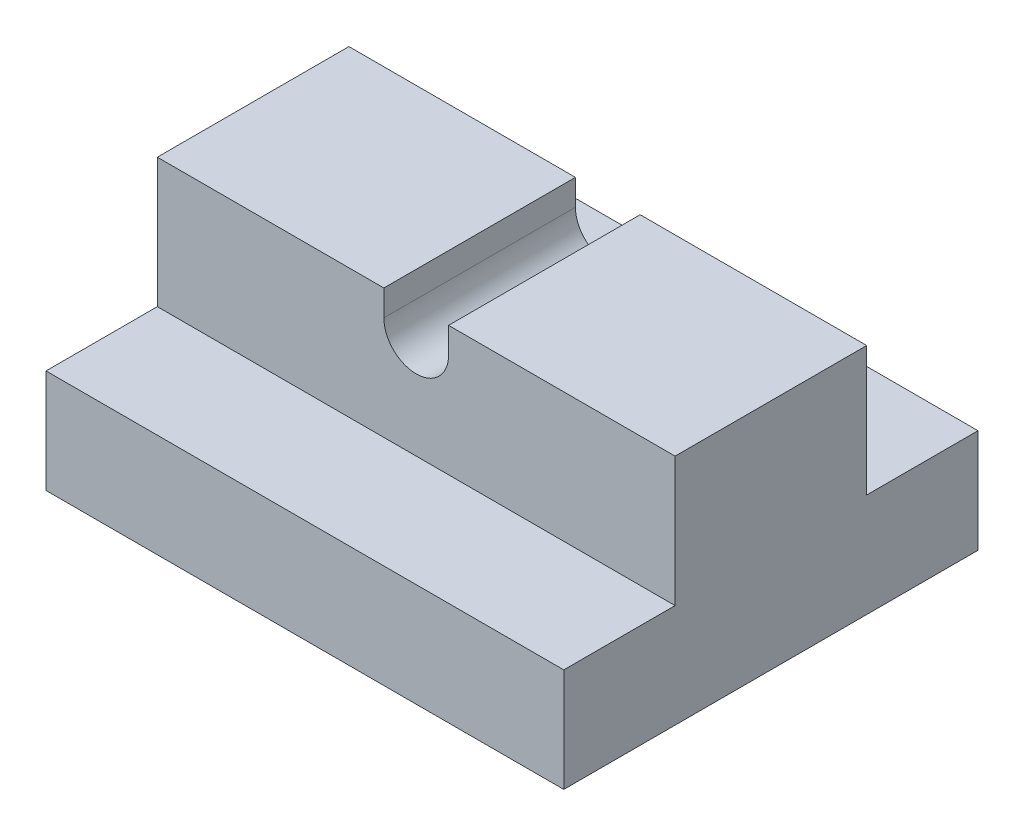
ISO-10303-21;
HEADER;
FILE_DESCRIPTION(('STEP AP214'),'2;1');
FILE_NAME('part.step','',(''),(''),'','','');
FILE_SCHEMA(('AUTOMOTIVE_DESIGN { 1 0 10303 214 1 1 1 1 }'));
ENDSEC;
DATA;
#1=APPLICATION_CONTEXT('core data for automotive mechanical design processes');
#2=APPLICATION_PROTOCOL_DEFINITION('international standard','automotive_design',2000,#1);
#3=PRODUCT_CONTEXT('',#1,'mechanical');
#4=PRODUCT('Part','Part','',(#3));
#5=PRODUCT_RELATED_PRODUCT_CATEGORY('part','',(#4));
#6=PRODUCT_DEFINITION_FORMATION('','',#4);
#7=PRODUCT_DEFINITION_CONTEXT('part definition',#1,'design');
#8=PRODUCT_DEFINITION('design','',#6,#7);
#9=PRODUCT_DEFINITION_SHAPE('','',#8);
#10=(LENGTH_UNIT() NAMED_UNIT(*) SI_UNIT(.MILLI.,.METRE.));
#11=(NAMED_UNIT(*) PLANE_ANGLE_UNIT() SI_UNIT($,.RADIAN.));
#12=(NAMED_UNIT(*) SI_UNIT($,.STERADIAN.) SOLID_ANGLE_UNIT());
#13=UNCERTAINTY_MEASURE_WITH_UNIT(LENGTH_MEASURE(1.E-05),#10,'distance_accuracy_value','');
#14=(GEOMETRIC_REPRESENTATION_CONTEXT(3) GLOBAL_UNCERTAINTY_ASSIGNED_CONTEXT((#13)) GLOBAL_UNIT_ASSIGNED_CONTEXT((#10,
#11,#12)) REPRESENTATION_CONTEXT('',''));
#15=CARTESIAN_POINT('',(0.,0.,0.));
#16=DIRECTION('',(0.,0.,1.));
#17=DIRECTION('',(1.,0.,0.));
#18=AXIS2_PLACEMENT_3D('',#15,#16,#17);
#19=CARTESIAN_POINT('',(0.,4.5,0.));
#20=DIRECTION('',(0.,-1.,0.));
#21=DIRECTION('',(0.,0.,-1.));
#22=AXIS2_PLACEMENT_3D('',#19,#20,#21);
#23=PLANE('',#22);
#24=DIRECTION('',(1.,0.,0.));
#25=VECTOR('',#24,1.);
#26=CARTESIAN_POINT('',(-5.,4.5,1.85));
#27=LINE('',#26,#25);
#28=CARTESIAN_POINT('',(-5.,4.5,1.85));
#29=VERTEX_POINT('',#28);
#30=CARTESIAN_POINT('',(-0.625000000000002,4.5,1.85));
#31=VERTEX_POINT('',#30);
#32=EDGE_CURVE('E163',#29,#31,#27,.T.);
#33=ORIENTED_EDGE('',*,*,#32,.T.);
#34=DIRECTION('',(0.,0.,1.));
#35=VECTOR('',#34,1.);
#36=CARTESIAN_POINT('',(-0.625000000000002,4.5,-4.001));
#37=LINE('',#36,#35);
#38=CARTESIAN_POINT('',(-0.625000000000002,4.5,-1.85));
#39=VERTEX_POINT('',#38);
#40=EDGE_CURVE('E151',#39,#31,#37,.T.);
#41=ORIENTED_EDGE('',*,*,#40,.F.);
#42=DIRECTION('',(-1.,0.,0.));
#43=VECTOR('',#42,1.);
#44=CARTESIAN_POINT('',(-5.,4.5,-1.85));
#45=LINE('',#44,#43);
#46=CARTESIAN_POINT('',(-5.,4.5,-1.85));
#47=VERTEX_POINT('',#46);
#48=EDGE_CURVE('E157',#39,#47,#45,.T.);
#49=ORIENTED_EDGE('',*,*,#48,.T.);
#50=DIRECTION('',(0.,0.,1.));
#51=VECTOR('',#50,1.);
#52=CARTESIAN_POINT('',(-5.,4.5,1.85));
#53=LINE('',#52,#51);
#54=EDGE_CURVE('E160',#47,#29,#53,.T.);
#55=ORIENTED_EDGE('',*,*,#54,.T.);
#56=EDGE_LOOP('',(#33,#41,#49,#55));
#57=FACE_BOUND('',#56,.T.);
#58=ADVANCED_FACE('F32',(#57),#23,.F.);
#59=CARTESIAN_POINT('',(0.,2.,0.));
#60=DIRECTION('',(0.,-1.,0.));
#61=DIRECTION('',(0.,0.,-1.));
#62=AXIS2_PLACEMENT_3D('',#59,#60,#61);
#63=PLANE('',#62);
#64=DIRECTION('',(1.,0.,0.));
#65=VECTOR('',#64,1.);
#66=CARTESIAN_POINT('',(-5.,2.,1.85));
#67=LINE('',#66,#65);
#68=CARTESIAN_POINT('',(-5.,2.,1.85));
#69=VERTEX_POINT('',#68);
#70=CARTESIAN_POINT('',(5.,2.,1.85));
#71=VERTEX_POINT('',#70);
#72=EDGE_CURVE('E55',#69,#71,#67,.T.);
#73=ORIENTED_EDGE('',*,*,#72,.F.);
#74=DIRECTION('',(0.,0.,1.));
#75=VECTOR('',#74,1.);
#76=CARTESIAN_POINT('',(-5.,2.,4.));
#77=LINE('',#76,#75);
#78=CARTESIAN_POINT('',(-5.,2.,4.));
#79=VERTEX_POINT('',#78);
#80=EDGE_CURVE('E187',#69,#79,#77,.T.);
#81=ORIENTED_EDGE('',*,*,#80,.T.);
#82=DIRECTION('',(1.,0.,0.));
#83=VECTOR('',#82,1.);
#84=CARTESIAN_POINT('',(-5.,2.,4.));
#85=LINE('',#84,#83);
#86=CARTESIAN_POINT('',(5.,2.,4.));
#87=VERTEX_POINT('',#86);
#88=EDGE_CURVE('E190',#79,#87,#85,.T.);
#89=ORIENTED_EDGE('',*,*,#88,.T.);
#90=DIRECTION('',(0.,0.,-1.));
#91=VECTOR('',#90,1.);
#92=CARTESIAN_POINT('',(5.,2.,4.));
#93=LINE('',#92,#91);
#94=EDGE_CURVE('E182',#87,#71,#93,.T.);
#95=ORIENTED_EDGE('',*,*,#94,.T.);
#96=EDGE_LOOP('',(#73,#81,#89,#95));
#97=FACE_BOUND('',#96,.T.);
#98=ADVANCED_FACE('F227',(#97),#63,.F.);
#99=DIRECTION('',(-1.,0.,0.));
#100=VECTOR('',#99,1.);
#101=CARTESIAN_POINT('',(-5.,2.,-1.85));
#102=LINE('',#101,#100);
#103=CARTESIAN_POINT('',(5.,2.,-1.85));
#104=VERTEX_POINT('',#103);
#105=CARTESIAN_POINT('',(-5.,2.,-1.85));
#106=VERTEX_POINT('',#105);
#107=EDGE_CURVE('E137',#104,#106,#102,.T.);
#108=ORIENTED_EDGE('',*,*,#107,.F.);
#109=CARTESIAN_POINT('',(5.,2.,-4.));
#110=VERTEX_POINT('',#109);
#111=EDGE_CURVE('E185',#104,#110,#93,.T.);
#112=ORIENTED_EDGE('',*,*,#111,.T.);
#113=DIRECTION('',(-1.,0.,0.));
#114=VECTOR('',#113,1.);
#115=CARTESIAN_POINT('',(-5.,2.,-4.));
#116=LINE('',#115,#114);
#117=CARTESIAN_POINT('',(-5.,2.,-4.));
#118=VERTEX_POINT('',#117);
#119=EDGE_CURVE('E184',#110,#118,#116,.T.);
#120=ORIENTED_EDGE('',*,*,#119,.T.);
#121=EDGE_CURVE('E188',#118,#106,#77,.T.);
#122=ORIENTED_EDGE('',*,*,#121,.T.);
#123=EDGE_LOOP('',(#108,#112,#120,#122));
#124=FACE_BOUND('',#123,.T.);
#125=ADVANCED_FACE('F241',(#124),#63,.F.);
#126=CARTESIAN_POINT('',(5.,2.,4.));
#127=DIRECTION('',(-1.,0.,0.));
#128=DIRECTION('',(0.,0.,1.));
#129=AXIS2_PLACEMENT_3D('',#126,#127,#128);
#130=PLANE('',#129);
#131=DIRECTION('',(0.,0.,-1.));
#132=VECTOR('',#131,1.);
#133=CARTESIAN_POINT('',(5.,0.,4.));
#134=LINE('',#133,#132);
#135=CARTESIAN_POINT('',(5.,0.,4.));
#136=VERTEX_POINT('',#135);
#137=CARTESIAN_POINT('',(5.,0.,-4.));
#138=VERTEX_POINT('',#137);
#139=EDGE_CURVE('E181',#136,#138,#134,.T.);
#140=ORIENTED_EDGE('',*,*,#139,.T.);
#141=DIRECTION('',(0.,-1.,0.));
#142=VECTOR('',#141,1.);
#143=CARTESIAN_POINT('',(5.,2.,-4.));
#144=LINE('',#143,#142);
#145=EDGE_CURVE('E11',#110,#138,#144,.T.);
#146=ORIENTED_EDGE('',*,*,#145,.F.);
#147=ORIENTED_EDGE('',*,*,#111,.F.);
#148=DIRECTION('',(0.,-1.,0.));
#149=VECTOR('',#148,1.);
#150=CARTESIAN_POINT('',(5.,4.5,-1.85));
#151=LINE('',#150,#149);
#152=CARTESIAN_POINT('',(5.,4.5,-1.85));
#153=VERTEX_POINT('',#152);
#154=EDGE_CURVE('E178',#153,#104,#151,.T.);
#155=ORIENTED_EDGE('',*,*,#154,.F.);
#156=DIRECTION('',(0.,0.,-1.));
#157=VECTOR('',#156,1.);
#158=CARTESIAN_POINT('',(5.,4.5,1.85));
#159=LINE('',#158,#157);
#160=CARTESIAN_POINT('',(5.,4.5,1.85));
#161=VERTEX_POINT('',#160);
#162=EDGE_CURVE('E154',#161,#153,#159,.T.);
#163=ORIENTED_EDGE('',*,*,#162,.F.);
#164=DIRECTION('',(0.,-1.,0.));
#165=VECTOR('',#164,1.);
#166=CARTESIAN_POINT('',(5.,4.5,1.85));
#167=LINE('',#166,#165);
#168=EDGE_CURVE('E166',#161,#71,#167,.T.);
#169=ORIENTED_EDGE('',*,*,#168,.T.);
#170=ORIENTED_EDGE('',*,*,#94,.F.);
#171=DIRECTION('',(0.,-1.,0.));
#172=VECTOR('',#171,1.);
#173=CARTESIAN_POINT('',(5.,2.,4.));
#174=LINE('',#173,#172);
#175=EDGE_CURVE('E192',#87,#136,#174,.T.);
#176=ORIENTED_EDGE('',*,*,#175,.T.);
#177=EDGE_LOOP('',(#140,#146,#147,#155,#163,#169,#170,#176));
#178=FACE_BOUND('',#177,.T.);
#179=ADVANCED_FACE('F34',(#178),#130,.F.);
#180=CARTESIAN_POINT('',(-5.,2.,-4.));
#181=DIRECTION('',(0.,0.,1.));
#182=DIRECTION('',(1.,0.,0.));
#183=AXIS2_PLACEMENT_3D('',#180,#181,#182);
#184=PLANE('',#183);
#185=DIRECTION('',(-1.,0.,0.));
#186=VECTOR('',#185,1.);
#187=CARTESIAN_POINT('',(-5.,0.,-4.));
#188=LINE('',#187,#186);
#189=CARTESIAN_POINT('',(-5.,0.,-4.));
#190=VERTEX_POINT('',#189);
#191=EDGE_CURVE('E195',#138,#190,#188,.T.);
#192=ORIENTED_EDGE('',*,*,#191,.T.);
#193=DIRECTION('',(0.,-1.,0.));
#194=VECTOR('',#193,1.);
#195=CARTESIAN_POINT('',(-5.,2.,-4.));
#196=LINE('',#195,#194);
#197=EDGE_CURVE('E40',#118,#190,#196,.T.);
#198=ORIENTED_EDGE('',*,*,#197,.F.);
#199=ORIENTED_EDGE('',*,*,#119,.F.);
#200=ORIENTED_EDGE('',*,*,#145,.T.);
#201=EDGE_LOOP('',(#192,#198,#199,#200));
#202=FACE_BOUND('',#201,.T.);
#203=ADVANCED_FACE('F242',(#202),#184,.F.);
#204=CARTESIAN_POINT('',(-5.,2.,4.));
#205=DIRECTION('',(1.,0.,0.));
#206=DIRECTION('',(0.,0.,-1.));
#207=AXIS2_PLACEMENT_3D('',#204,#205,#206);
#208=PLANE('',#207);
#209=DIRECTION('',(0.,0.,1.));
#210=VECTOR('',#209,1.);
#211=CARTESIAN_POINT('',(-5.,0.,4.));
#212=LINE('',#211,#210);
#213=CARTESIAN_POINT('',(-5.,0.,4.));
#214=VERTEX_POINT('',#213);
#215=EDGE_CURVE('E197',#190,#214,#212,.T.);
#216=ORIENTED_EDGE('',*,*,#215,.T.);
#217=DIRECTION('',(0.,-1.,0.));
#218=VECTOR('',#217,1.);
#219=CARTESIAN_POINT('',(-5.,2.,4.));
#220=LINE('',#219,#218);
#221=EDGE_CURVE('E203',#79,#214,#220,.T.);
#222=ORIENTED_EDGE('',*,*,#221,.F.);
#223=ORIENTED_EDGE('',*,*,#80,.F.);
#224=DIRECTION('',(0.,-1.,0.));
#225=VECTOR('',#224,1.);
#226=CARTESIAN_POINT('',(-5.,4.5,1.85));
#227=LINE('',#226,#225);
#228=EDGE_CURVE('E172',#29,#69,#227,.T.);
#229=ORIENTED_EDGE('',*,*,#228,.F.);
#230=ORIENTED_EDGE('',*,*,#54,.F.);
#231=DIRECTION('',(0.,-1.,0.));
#232=VECTOR('',#231,1.);
#233=CARTESIAN_POINT('',(-5.,4.5,-1.85));
#234=LINE('',#233,#232);
#235=EDGE_CURVE('E175',#47,#106,#234,.T.);
#236=ORIENTED_EDGE('',*,*,#235,.T.);
#237=ORIENTED_EDGE('',*,*,#121,.F.);
#238=ORIENTED_EDGE('',*,*,#197,.T.);
#239=EDGE_LOOP('',(#216,#222,#223,#229,#230,#236,#237,#238));
#240=FACE_BOUND('',#239,.T.);
#241=ADVANCED_FACE('F210',(#240),#208,.F.);
#242=CARTESIAN_POINT('',(-5.,2.,4.));
#243=DIRECTION('',(0.,0.,-1.));
#244=DIRECTION('',(-1.,0.,0.));
#245=AXIS2_PLACEMENT_3D('',#242,#243,#244);
#246=PLANE('',#245);
#247=DIRECTION('',(1.,0.,0.));
#248=VECTOR('',#247,1.);
#249=CARTESIAN_POINT('',(-5.,0.,4.));
#250=LINE('',#249,#248);
#251=EDGE_CURVE('E199',#214,#136,#250,.T.);
#252=ORIENTED_EDGE('',*,*,#251,.T.);
#253=ORIENTED_EDGE('',*,*,#175,.F.);
#254=ORIENTED_EDGE('',*,*,#88,.F.);
#255=ORIENTED_EDGE('',*,*,#221,.T.);
#256=EDGE_LOOP('',(#252,#253,#254,#255));
#257=FACE_BOUND('',#256,.T.);
#258=ADVANCED_FACE('F220',(#257),#246,.F.);
#259=CARTESIAN_POINT('',(0.,0.,0.));
#260=DIRECTION('',(0.,-1.,0.));
#261=DIRECTION('',(0.,0.,-1.));
#262=AXIS2_PLACEMENT_3D('',#259,#260,#261);
#263=PLANE('',#262);
#264=ORIENTED_EDGE('',*,*,#139,.F.);
#265=ORIENTED_EDGE('',*,*,#251,.F.);
#266=ORIENTED_EDGE('',*,*,#215,.F.);
#267=ORIENTED_EDGE('',*,*,#191,.F.);
#268=EDGE_LOOP('',(#264,#265,#266,#267));
#269=FACE_BOUND('',#268,.T.);
#270=ADVANCED_FACE('F217',(#269),#263,.T.);
#271=CARTESIAN_POINT('',(-5.,4.5,-1.85));
#272=DIRECTION('',(0.,0.,1.));
#273=DIRECTION('',(1.,0.,0.));
#274=AXIS2_PLACEMENT_3D('',#271,#272,#273);
#275=PLANE('',#274);
#276=ORIENTED_EDGE('',*,*,#48,.F.);
#277=DIRECTION('',(0.,1.,0.));
#278=VECTOR('',#277,1.);
#279=CARTESIAN_POINT('',(-0.625000000000002,4.,-1.85));
#280=LINE('',#279,#278);
#281=CARTESIAN_POINT('',(-0.625000000000002,4.,-1.85));
#282=VERTEX_POINT('',#281);
#283=EDGE_CURVE('E142',#282,#39,#280,.T.);
#284=ORIENTED_EDGE('',*,*,#283,.F.);
#285=CARTESIAN_POINT('',(0.,4.,-1.85));
#286=DIRECTION('',(0.,0.,1.));
#287=DIRECTION('',(1.,0.,0.));
#288=AXIS2_PLACEMENT_3D('',#285,#286,#287);
#289=CIRCLE('',#288,0.625);
#290=CARTESIAN_POINT('',(0.624999999999998,4.,-1.85));
#291=VERTEX_POINT('',#290);
#292=EDGE_CURVE('E125',#291,#282,#289,.F.);
#293=ORIENTED_EDGE('',*,*,#292,.F.);
#294=DIRECTION('',(0.,-1.,0.));
#295=VECTOR('',#294,1.);
#296=CARTESIAN_POINT('',(0.624999999999998,4.5,-1.85));
#297=LINE('',#296,#295);
#298=CARTESIAN_POINT('',(0.624999999999998,4.5,-1.85));
#299=VERTEX_POINT('',#298);
#300=EDGE_CURVE('E133',#299,#291,#297,.T.);
#301=ORIENTED_EDGE('',*,*,#300,.F.);
#302=EDGE_CURVE('E158',#153,#299,#45,.T.);
#303=ORIENTED_EDGE('',*,*,#302,.F.);
#304=ORIENTED_EDGE('',*,*,#154,.T.);
#305=ORIENTED_EDGE('',*,*,#107,.T.);
#306=ORIENTED_EDGE('',*,*,#235,.F.);
#307=EDGE_LOOP('',(#276,#284,#293,#301,#303,#304,#305,#306));
#308=FACE_BOUND('',#307,.T.);
#309=ADVANCED_FACE('F141',(#308),#275,.F.);
#310=CARTESIAN_POINT('',(-5.,4.5,1.85));
#311=DIRECTION('',(0.,0.,-1.));
#312=DIRECTION('',(-1.,0.,0.));
#313=AXIS2_PLACEMENT_3D('',#310,#311,#312);
#314=PLANE('',#313);
#315=CARTESIAN_POINT('',(0.,4.,1.85));
#316=DIRECTION('',(0.,0.,1.));
#317=DIRECTION('',(1.,0.,0.));
#318=AXIS2_PLACEMENT_3D('',#315,#316,#317);
#319=CIRCLE('',#318,0.625);
#320=CARTESIAN_POINT('',(-0.625000000000002,4.,1.85));
#321=VERTEX_POINT('',#320);
#322=CARTESIAN_POINT('',(0.624999999999998,4.,1.85));
#323=VERTEX_POINT('',#322);
#324=EDGE_CURVE('E128',#321,#323,#319,.T.);
#325=ORIENTED_EDGE('',*,*,#324,.F.);
#326=DIRECTION('',(0.,-1.,0.));
#327=VECTOR('',#326,1.);
#328=CARTESIAN_POINT('',(-0.625000000000002,4.,1.85));
#329=LINE('',#328,#327);
#330=EDGE_CURVE('E130',#31,#321,#329,.T.);
#331=ORIENTED_EDGE('',*,*,#330,.F.);
#332=ORIENTED_EDGE('',*,*,#32,.F.);
#333=ORIENTED_EDGE('',*,*,#228,.T.);
#334=ORIENTED_EDGE('',*,*,#72,.T.);
#335=ORIENTED_EDGE('',*,*,#168,.F.);
#336=CARTESIAN_POINT('',(0.624999999999996,4.5,1.85));
#337=VERTEX_POINT('',#336);
#338=EDGE_CURVE('E162',#337,#161,#27,.T.);
#339=ORIENTED_EDGE('',*,*,#338,.F.);
#340=DIRECTION('',(0.,1.,0.));
#341=VECTOR('',#340,1.);
#342=CARTESIAN_POINT('',(0.624999999999998,4.5,1.85));
#343=LINE('',#342,#341);
#344=EDGE_CURVE('E47',#323,#337,#343,.T.);
#345=ORIENTED_EDGE('',*,*,#344,.F.);
#346=EDGE_LOOP('',(#325,#331,#332,#333,#334,#335,#339,#345));
#347=FACE_BOUND('',#346,.T.);
#348=ADVANCED_FACE('F229',(#347),#314,.F.);
#349=ORIENTED_EDGE('',*,*,#302,.T.);
#350=DIRECTION('',(0.,0.,1.));
#351=VECTOR('',#350,1.);
#352=CARTESIAN_POINT('',(0.624999999999998,4.5,-4.001));
#353=LINE('',#352,#351);
#354=EDGE_CURVE('E129',#299,#337,#353,.T.);
#355=ORIENTED_EDGE('',*,*,#354,.T.);
#356=ORIENTED_EDGE('',*,*,#338,.T.);
#357=ORIENTED_EDGE('',*,*,#162,.T.);
#358=EDGE_LOOP('',(#349,#355,#356,#357));
#359=FACE_BOUND('',#358,.T.);
#360=ADVANCED_FACE('F251',(#359),#23,.F.);
#361=CARTESIAN_POINT('',(0.,4.,-4.001));
#362=DIRECTION('',(0.,0.,1.));
#363=DIRECTION('',(1.,0.,0.));
#364=AXIS2_PLACEMENT_3D('',#361,#362,#363);
#365=CYLINDRICAL_SURFACE('',#364,0.625);
#366=ORIENTED_EDGE('',*,*,#292,.T.);
#367=DIRECTION('',(0.,0.,1.));
#368=VECTOR('',#367,1.);
#369=CARTESIAN_POINT('',(-0.625000000000002,4.,-4.001));
#370=LINE('',#369,#368);
#371=EDGE_CURVE('E138',#282,#321,#370,.T.);
#372=ORIENTED_EDGE('',*,*,#371,.T.);
#373=ORIENTED_EDGE('',*,*,#324,.T.);
#374=DIRECTION('',(0.,0.,1.));
#375=VECTOR('',#374,1.);
#376=CARTESIAN_POINT('',(0.624999999999998,4.,-4.001));
#377=LINE('',#376,#375);
#378=EDGE_CURVE('E121',#291,#323,#377,.T.);
#379=ORIENTED_EDGE('',*,*,#378,.F.);
#380=EDGE_LOOP('',(#366,#372,#373,#379));
#381=FACE_BOUND('',#380,.T.);
#382=ADVANCED_FACE('F123',(#381),#365,.F.);
#383=CARTESIAN_POINT('',(-0.625000000000002,4.,-4.001));
#384=DIRECTION('',(-1.,0.,0.));
#385=DIRECTION('',(0.,0.,1.));
#386=AXIS2_PLACEMENT_3D('',#383,#384,#385);
#387=PLANE('',#386);
#388=ORIENTED_EDGE('',*,*,#283,.T.);
#389=ORIENTED_EDGE('',*,*,#40,.T.);
#390=ORIENTED_EDGE('',*,*,#330,.T.);
#391=ORIENTED_EDGE('',*,*,#371,.F.);
#392=EDGE_LOOP('',(#388,#389,#390,#391));
#393=FACE_BOUND('',#392,.T.);
#394=ADVANCED_FACE('F264',(#393),#387,.F.);
#395=CARTESIAN_POINT('',(0.624999999999998,4.5,-4.001));
#396=DIRECTION('',(1.,0.,0.));
#397=DIRECTION('',(0.,0.,-1.));
#398=AXIS2_PLACEMENT_3D('',#395,#396,#397);
#399=PLANE('',#398);
#400=ORIENTED_EDGE('',*,*,#300,.T.);
#401=ORIENTED_EDGE('',*,*,#378,.T.);
#402=ORIENTED_EDGE('',*,*,#344,.T.);
#403=ORIENTED_EDGE('',*,*,#354,.F.);
#404=EDGE_LOOP('',(#400,#401,#402,#403));
#405=FACE_BOUND('',#404,.T.);
#406=ADVANCED_FACE('F134',(#405),#399,.F.);
#407=CLOSED_SHELL('',(#58,#98,#125,#179,#203,#241,#258,#270,#309,#348,#360,#382,#394,#406));
#408=MANIFOLD_SOLID_BREP('B2',#407);
#409=ADVANCED_BREP_SHAPE_REPRESENTATION('',(#18,#408),#14);
#410=SHAPE_DEFINITION_REPRESENTATION(#9,#409);
ENDSEC;
END-ISO-10303-21;
